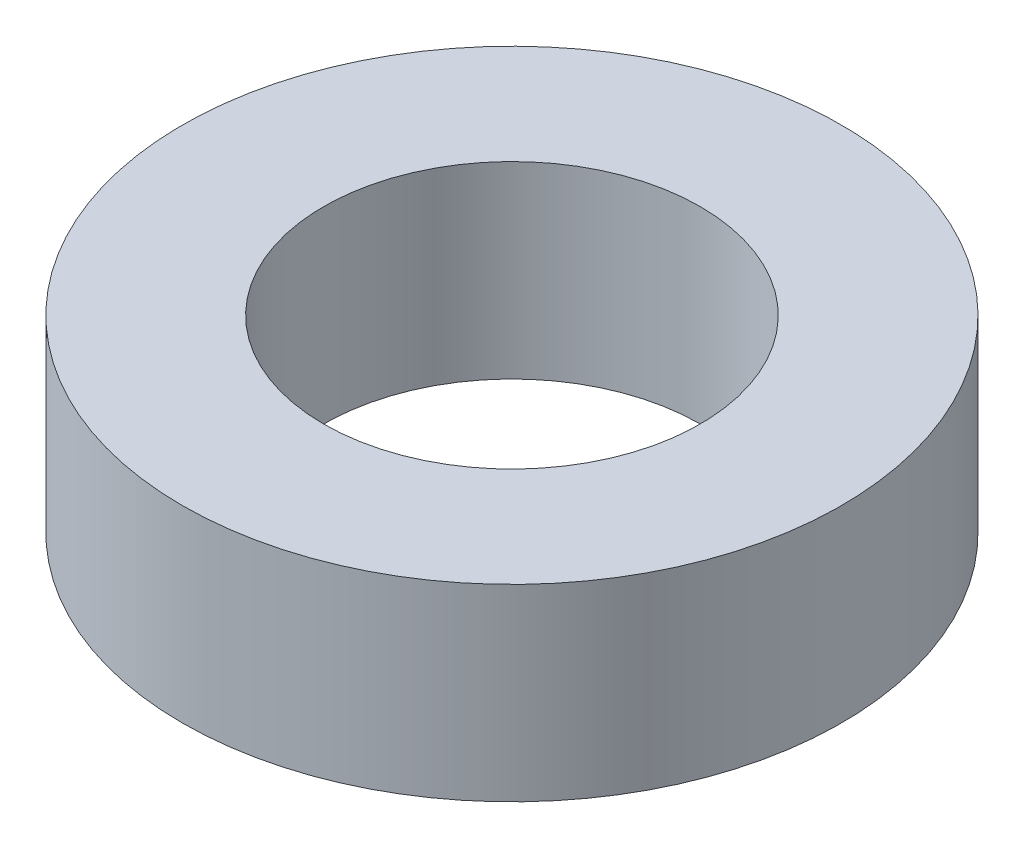
ISO-10303-21;
HEADER;
FILE_DESCRIPTION(('STEP AP214'),'2;1');
FILE_NAME('part.step','',(''),(''),'','','');
FILE_SCHEMA(('AUTOMOTIVE_DESIGN { 1 0 10303 214 1 1 1 1 }'));
ENDSEC;
DATA;
#1=APPLICATION_CONTEXT('core data for automotive mechanical design processes');
#2=APPLICATION_PROTOCOL_DEFINITION('international standard','automotive_design',2000,#1);
#3=PRODUCT_CONTEXT('',#1,'mechanical');
#4=PRODUCT('Part','Part','',(#3));
#5=PRODUCT_RELATED_PRODUCT_CATEGORY('part','',(#4));
#6=PRODUCT_DEFINITION_FORMATION('','',#4);
#7=PRODUCT_DEFINITION_CONTEXT('part definition',#1,'design');
#8=PRODUCT_DEFINITION('design','',#6,#7);
#9=PRODUCT_DEFINITION_SHAPE('','',#8);
#10=(LENGTH_UNIT() NAMED_UNIT(*) SI_UNIT(.MILLI.,.METRE.));
#11=(NAMED_UNIT(*) PLANE_ANGLE_UNIT() SI_UNIT($,.RADIAN.));
#12=(NAMED_UNIT(*) SI_UNIT($,.STERADIAN.) SOLID_ANGLE_UNIT());
#13=UNCERTAINTY_MEASURE_WITH_UNIT(LENGTH_MEASURE(1.E-05),#10,'distance_accuracy_value','');
#14=(GEOMETRIC_REPRESENTATION_CONTEXT(3) GLOBAL_UNCERTAINTY_ASSIGNED_CONTEXT((#13)) GLOBAL_UNIT_ASSIGNED_CONTEXT((#10,
#11,#12)) REPRESENTATION_CONTEXT('',''));
#15=CARTESIAN_POINT('',(0.,0.,0.));
#16=DIRECTION('',(0.,0.,1.));
#17=DIRECTION('',(1.,0.,0.));
#18=AXIS2_PLACEMENT_3D('',#15,#16,#17);
#19=CARTESIAN_POINT('',(0.,10.,0.));
#20=DIRECTION('',(0.,1.,0.));
#21=DIRECTION('',(0.,0.,1.));
#22=AXIS2_PLACEMENT_3D('',#19,#20,#21);
#23=PLANE('',#22);
#24=CARTESIAN_POINT('',(0.,10.,0.));
#25=DIRECTION('',(0.,1.,0.));
#26=DIRECTION('',(0.,0.,1.));
#27=AXIS2_PLACEMENT_3D('',#24,#25,#26);
#28=CIRCLE('',#27,17.5);
#29=CARTESIAN_POINT('',(0.,10.,17.5));
#30=VERTEX_POINT('',#29);
#31=EDGE_CURVE('E10',#30,#30,#28,.T.);
#32=ORIENTED_EDGE('',*,*,#31,.T.);
#33=EDGE_LOOP('',(#32));
#34=FACE_BOUND('',#33,.T.);
#35=CARTESIAN_POINT('',(0.,10.,0.));
#36=DIRECTION('',(0.,1.,0.));
#37=DIRECTION('',(0.,0.,1.));
#38=AXIS2_PLACEMENT_3D('',#35,#36,#37);
#39=CIRCLE('',#38,10.);
#40=CARTESIAN_POINT('',(0.,10.,10.));
#41=VERTEX_POINT('',#40);
#42=EDGE_CURVE('E44',#41,#41,#39,.T.);
#43=ORIENTED_EDGE('',*,*,#42,.F.);
#44=EDGE_LOOP('',(#43));
#45=FACE_BOUND('',#44,.T.);
#46=ADVANCED_FACE('F33',(#34,#45),#23,.T.);
#47=CARTESIAN_POINT('',(0.,0.,0.));
#48=DIRECTION('',(0.,1.,0.));
#49=DIRECTION('',(0.,0.,1.));
#50=AXIS2_PLACEMENT_3D('',#47,#48,#49);
#51=PLANE('',#50);
#52=CARTESIAN_POINT('',(0.,0.,0.));
#53=DIRECTION('',(0.,1.,0.));
#54=DIRECTION('',(0.,0.,1.));
#55=AXIS2_PLACEMENT_3D('',#52,#53,#54);
#56=CIRCLE('',#55,17.5);
#57=CARTESIAN_POINT('',(0.,0.,17.5));
#58=VERTEX_POINT('',#57);
#59=EDGE_CURVE('E37',#58,#58,#56,.T.);
#60=ORIENTED_EDGE('',*,*,#59,.F.);
#61=EDGE_LOOP('',(#60));
#62=FACE_BOUND('',#61,.T.);
#63=CARTESIAN_POINT('',(0.,0.,0.));
#64=DIRECTION('',(0.,1.,0.));
#65=DIRECTION('',(0.,0.,1.));
#66=AXIS2_PLACEMENT_3D('',#63,#64,#65);
#67=CIRCLE('',#66,10.);
#68=CARTESIAN_POINT('',(0.,0.,10.));
#69=VERTEX_POINT('',#68);
#70=EDGE_CURVE('E46',#69,#69,#67,.T.);
#71=ORIENTED_EDGE('',*,*,#70,.T.);
#72=EDGE_LOOP('',(#71));
#73=FACE_BOUND('',#72,.T.);
#74=ADVANCED_FACE('F56',(#62,#73),#51,.F.);
#75=CARTESIAN_POINT('',(0.,10.,0.));
#76=DIRECTION('',(0.,-1.,0.));
#77=DIRECTION('',(0.,0.,-1.));
#78=AXIS2_PLACEMENT_3D('',#75,#76,#77);
#79=CYLINDRICAL_SURFACE('',#78,17.5);
#80=ORIENTED_EDGE('',*,*,#31,.F.);
#81=EDGE_LOOP('',(#80));
#82=FACE_BOUND('',#81,.T.);
#83=ORIENTED_EDGE('',*,*,#59,.T.);
#84=EDGE_LOOP('',(#83));
#85=FACE_BOUND('',#84,.T.);
#86=ADVANCED_FACE('F35',(#82,#85),#79,.T.);
#87=CARTESIAN_POINT('',(0.,10.,0.));
#88=DIRECTION('',(0.,-1.,0.));
#89=DIRECTION('',(0.,0.,-1.));
#90=AXIS2_PLACEMENT_3D('',#87,#88,#89);
#91=CYLINDRICAL_SURFACE('',#90,10.);
#92=ORIENTED_EDGE('',*,*,#42,.T.);
#93=EDGE_LOOP('',(#92));
#94=FACE_BOUND('',#93,.T.);
#95=ORIENTED_EDGE('',*,*,#70,.F.);
#96=EDGE_LOOP('',(#95));
#97=FACE_BOUND('',#96,.T.);
#98=ADVANCED_FACE('F52',(#94,#97),#91,.F.);
#99=CLOSED_SHELL('',(#46,#74,#86,#98));
#100=MANIFOLD_SOLID_BREP('B2',#99);
#101=ADVANCED_BREP_SHAPE_REPRESENTATION('',(#18,#100),#14);
#102=SHAPE_DEFINITION_REPRESENTATION(#9,#101);
ENDSEC;
END-ISO-10303-21;
